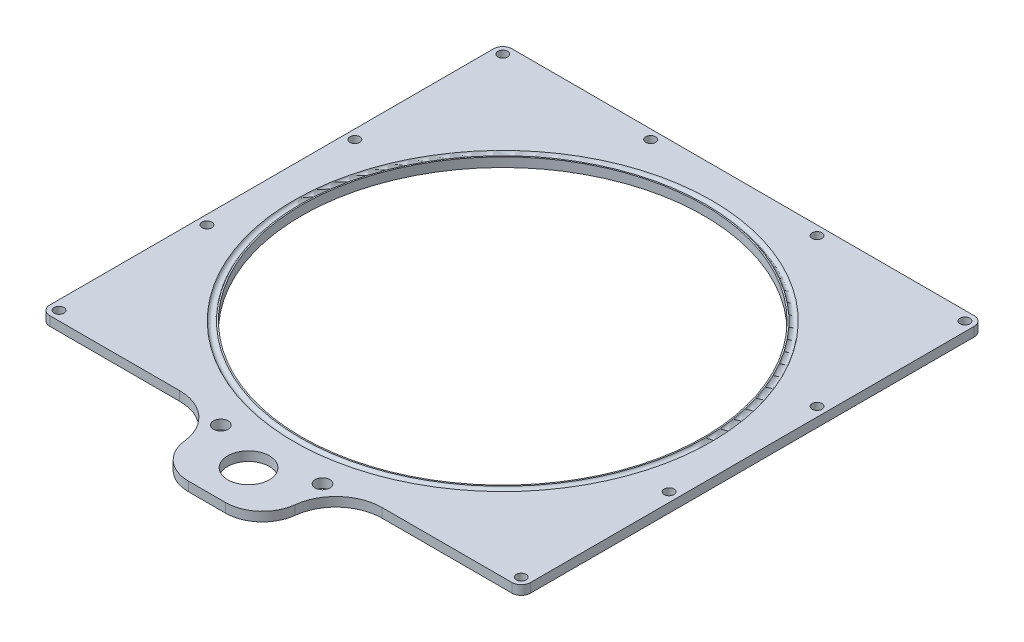
ISO-10303-21;
HEADER;
FILE_DESCRIPTION(('STEP AP214'),'2;1');
FILE_NAME('part.step','',(''),(''),'','','');
FILE_SCHEMA(('AUTOMOTIVE_DESIGN { 1 0 10303 214 1 1 1 1 }'));
ENDSEC;
DATA;
#1=APPLICATION_CONTEXT('core data for automotive mechanical design processes');
#2=APPLICATION_PROTOCOL_DEFINITION('international standard','automotive_design',2000,#1);
#3=PRODUCT_CONTEXT('',#1,'mechanical');
#4=PRODUCT('Part','Part','',(#3));
#5=PRODUCT_RELATED_PRODUCT_CATEGORY('part','',(#4));
#6=PRODUCT_DEFINITION_FORMATION('','',#4);
#7=PRODUCT_DEFINITION_CONTEXT('part definition',#1,'design');
#8=PRODUCT_DEFINITION('design','',#6,#7);
#9=PRODUCT_DEFINITION_SHAPE('','',#8);
#10=(LENGTH_UNIT() NAMED_UNIT(*) SI_UNIT(.MILLI.,.METRE.));
#11=(NAMED_UNIT(*) PLANE_ANGLE_UNIT() SI_UNIT($,.RADIAN.));
#12=(NAMED_UNIT(*) SI_UNIT($,.STERADIAN.) SOLID_ANGLE_UNIT());
#13=UNCERTAINTY_MEASURE_WITH_UNIT(LENGTH_MEASURE(1.E-05),#10,'distance_accuracy_value','');
#14=(GEOMETRIC_REPRESENTATION_CONTEXT(3) GLOBAL_UNCERTAINTY_ASSIGNED_CONTEXT((#13)) GLOBAL_UNIT_ASSIGNED_CONTEXT((#10,
#11,#12)) REPRESENTATION_CONTEXT('',''));
#15=CARTESIAN_POINT('',(0.,0.,0.));
#16=DIRECTION('',(0.,0.,1.));
#17=DIRECTION('',(1.,0.,0.));
#18=AXIS2_PLACEMENT_3D('',#15,#16,#17);
#19=CARTESIAN_POINT('',(0.,6.35,0.));
#20=DIRECTION('',(0.,-1.,0.));
#21=DIRECTION('',(0.,0.,-1.));
#22=AXIS2_PLACEMENT_3D('',#19,#20,#21);
#23=PLANE('',#22);
#24=CARTESIAN_POINT('',(0.,6.35,174.625));
#25=DIRECTION('',(0.,1.,0.));
#26=DIRECTION('',(0.,0.,1.));
#27=AXIS2_PLACEMENT_3D('',#24,#25,#26);
#28=CIRCLE('',#27,14.2875);
#29=CARTESIAN_POINT('',(0.,6.35,188.9125));
#30=VERTEX_POINT('',#29);
#31=EDGE_CURVE('E326',#30,#30,#28,.T.);
#32=ORIENTED_EDGE('',*,*,#31,.F.);
#33=EDGE_LOOP('',(#32));
#34=FACE_BOUND('',#33,.T.);
#35=DIRECTION('',(0.,0.,1.));
#36=VECTOR('',#35,1.);
#37=CARTESIAN_POINT('',(-165.1,6.35,152.4));
#38=LINE('',#37,#36);
#39=CARTESIAN_POINT('',(-165.1,6.35,-158.75));
#40=VERTEX_POINT('',#39);
#41=CARTESIAN_POINT('',(-165.1,6.35,146.05));
#42=VERTEX_POINT('',#41);
#43=EDGE_CURVE('E341',#40,#42,#38,.T.);
#44=ORIENTED_EDGE('',*,*,#43,.T.);
#45=CARTESIAN_POINT('',(-158.75,6.35,146.05));
#46=DIRECTION('',(0.,-1.,0.));
#47=DIRECTION('',(0.,0.,-1.));
#48=AXIS2_PLACEMENT_3D('',#45,#46,#47);
#49=CIRCLE('',#48,6.35);
#50=CARTESIAN_POINT('',(-158.75,6.35,152.4));
#51=VERTEX_POINT('',#50);
#52=EDGE_CURVE('E228',#42,#51,#49,.F.);
#53=ORIENTED_EDGE('',*,*,#52,.T.);
#54=DIRECTION('',(1.,0.,0.));
#55=VECTOR('',#54,1.);
#56=CARTESIAN_POINT('',(-165.1,6.35,152.4));
#57=LINE('',#56,#55);
#58=CARTESIAN_POINT('',(-69.4961266284947,6.35,152.4));
#59=VERTEX_POINT('',#58);
#60=EDGE_CURVE('E344',#51,#59,#57,.T.);
#61=ORIENTED_EDGE('',*,*,#60,.T.);
#62=CARTESIAN_POINT('',(-69.4961266284947,6.35,184.15));
#63=DIRECTION('',(0.,-1.,0.));
#64=DIRECTION('',(0.,0.,-1.));
#65=AXIS2_PLACEMENT_3D('',#62,#63,#64);
#66=CIRCLE('',#65,31.75);
#67=CARTESIAN_POINT('',(-37.9427229459976,6.35,180.622222222222));
#68=VERTEX_POINT('',#67);
#69=EDGE_CURVE('E205',#59,#68,#66,.T.);
#70=ORIENTED_EDGE('',*,*,#69,.T.);
#71=CARTESIAN_POINT('',(-12.7,6.35,177.8));
#72=DIRECTION('',(0.,-1.,0.));
#73=DIRECTION('',(0.,0.,-1.));
#74=AXIS2_PLACEMENT_3D('',#71,#72,#73);
#75=CIRCLE('',#74,25.4);
#76=CARTESIAN_POINT('',(-12.7,6.35,203.2));
#77=VERTEX_POINT('',#76);
#78=EDGE_CURVE('E185',#68,#77,#75,.F.);
#79=ORIENTED_EDGE('',*,*,#78,.T.);
#80=DIRECTION('',(1.,0.,0.));
#81=VECTOR('',#80,1.);
#82=CARTESIAN_POINT('',(38.1,6.35,203.2));
#83=LINE('',#82,#81);
#84=CARTESIAN_POINT('',(12.7,6.35,203.2));
#85=VERTEX_POINT('',#84);
#86=EDGE_CURVE('E166',#77,#85,#83,.T.);
#87=ORIENTED_EDGE('',*,*,#86,.T.);
#88=CARTESIAN_POINT('',(12.7,6.35,177.8));
#89=DIRECTION('',(0.,-1.,0.));
#90=DIRECTION('',(0.,0.,-1.));
#91=AXIS2_PLACEMENT_3D('',#88,#89,#90);
#92=CIRCLE('',#91,25.4);
#93=CARTESIAN_POINT('',(37.9427229459976,6.35,180.622222222222));
#94=VERTEX_POINT('',#93);
#95=EDGE_CURVE('E187',#85,#94,#92,.F.);
#96=ORIENTED_EDGE('',*,*,#95,.T.);
#97=CARTESIAN_POINT('',(69.4961266284947,6.35,184.15));
#98=DIRECTION('',(0.,-1.,0.));
#99=DIRECTION('',(0.,0.,-1.));
#100=AXIS2_PLACEMENT_3D('',#97,#98,#99);
#101=CIRCLE('',#100,31.75);
#102=CARTESIAN_POINT('',(69.4961266284947,6.35,152.4));
#103=VERTEX_POINT('',#102);
#104=EDGE_CURVE('E201',#94,#103,#101,.T.);
#105=ORIENTED_EDGE('',*,*,#104,.T.);
#106=DIRECTION('',(1.,0.,0.));
#107=VECTOR('',#106,1.);
#108=CARTESIAN_POINT('',(38.1,6.35,152.4));
#109=LINE('',#108,#107);
#110=CARTESIAN_POINT('',(158.75,6.35,152.4));
#111=VERTEX_POINT('',#110);
#112=EDGE_CURVE('E157',#103,#111,#109,.T.);
#113=ORIENTED_EDGE('',*,*,#112,.T.);
#114=CARTESIAN_POINT('',(158.75,6.35,146.05));
#115=DIRECTION('',(0.,-1.,0.));
#116=DIRECTION('',(0.,0.,-1.));
#117=AXIS2_PLACEMENT_3D('',#114,#115,#116);
#118=CIRCLE('',#117,6.35);
#119=CARTESIAN_POINT('',(165.1,6.35,146.05));
#120=VERTEX_POINT('',#119);
#121=EDGE_CURVE('E226',#111,#120,#118,.F.);
#122=ORIENTED_EDGE('',*,*,#121,.T.);
#123=DIRECTION('',(0.,0.,-1.));
#124=VECTOR('',#123,1.);
#125=CARTESIAN_POINT('',(165.1,6.35,152.4));
#126=LINE('',#125,#124);
#127=CARTESIAN_POINT('',(165.1,6.35,-158.75));
#128=VERTEX_POINT('',#127);
#129=EDGE_CURVE('E177',#120,#128,#126,.T.);
#130=ORIENTED_EDGE('',*,*,#129,.T.);
#131=CARTESIAN_POINT('',(158.75,6.35,-158.75));
#132=DIRECTION('',(0.,-1.,0.));
#133=DIRECTION('',(0.,0.,-1.));
#134=AXIS2_PLACEMENT_3D('',#131,#132,#133);
#135=CIRCLE('',#134,6.35);
#136=CARTESIAN_POINT('',(158.75,6.35,-165.1));
#137=VERTEX_POINT('',#136);
#138=EDGE_CURVE('E64',#128,#137,#135,.F.);
#139=ORIENTED_EDGE('',*,*,#138,.T.);
#140=DIRECTION('',(-1.,0.,0.));
#141=VECTOR('',#140,1.);
#142=CARTESIAN_POINT('',(-165.1,6.35,-165.1));
#143=LINE('',#142,#141);
#144=CARTESIAN_POINT('',(-158.75,6.35,-165.1));
#145=VERTEX_POINT('',#144);
#146=EDGE_CURVE('E339',#137,#145,#143,.T.);
#147=ORIENTED_EDGE('',*,*,#146,.T.);
#148=CARTESIAN_POINT('',(-158.75,6.35,-158.75));
#149=DIRECTION('',(0.,-1.,0.));
#150=DIRECTION('',(0.,0.,-1.));
#151=AXIS2_PLACEMENT_3D('',#148,#149,#150);
#152=CIRCLE('',#151,6.35);
#153=EDGE_CURVE('E223',#145,#40,#152,.F.);
#154=ORIENTED_EDGE('',*,*,#153,.T.);
#155=EDGE_LOOP('',(#44,#53,#61,#70,#79,#87,#96,#105,#113,#122,#130,#139,#147,#154));
#156=FACE_BOUND('',#155,.T.);
#157=CARTESIAN_POINT('',(34.925,6.35,158.75));
#158=DIRECTION('',(0.,-1.,0.));
#159=DIRECTION('',(0.,0.,-1.));
#160=AXIS2_PLACEMENT_3D('',#157,#158,#159);
#161=CIRCLE('',#160,5.04189999999999);
#162=CARTESIAN_POINT('',(34.925,6.35,153.7081));
#163=VERTEX_POINT('',#162);
#164=EDGE_CURVE('E322',#163,#163,#161,.T.);
#165=ORIENTED_EDGE('',*,*,#164,.T.);
#166=EDGE_LOOP('',(#165));
#167=FACE_BOUND('',#166,.T.);
#168=CARTESIAN_POINT('',(-34.925,6.35,158.75));
#169=DIRECTION('',(0.,-1.,0.));
#170=DIRECTION('',(0.,0.,-1.));
#171=AXIS2_PLACEMENT_3D('',#168,#169,#170);
#172=CIRCLE('',#171,5.0419);
#173=CARTESIAN_POINT('',(-34.925,6.35,153.7081));
#174=VERTEX_POINT('',#173);
#175=EDGE_CURVE('E316',#174,#174,#172,.T.);
#176=ORIENTED_EDGE('',*,*,#175,.T.);
#177=EDGE_LOOP('',(#176));
#178=FACE_BOUND('',#177,.T.);
#179=CARTESIAN_POINT('',(57.15,6.35,-158.75));
#180=DIRECTION('',(0.,1.,0.));
#181=DIRECTION('',(0.,0.,1.));
#182=AXIS2_PLACEMENT_3D('',#179,#180,#181);
#183=CIRCLE('',#182,3.3782);
#184=CARTESIAN_POINT('',(57.15,6.35,-155.3718));
#185=VERTEX_POINT('',#184);
#186=EDGE_CURVE('E307',#185,#185,#183,.T.);
#187=ORIENTED_EDGE('',*,*,#186,.F.);
#188=EDGE_LOOP('',(#187));
#189=FACE_BOUND('',#188,.T.);
#190=CARTESIAN_POINT('',(-57.15,6.35,-158.75));
#191=DIRECTION('',(0.,1.,0.));
#192=DIRECTION('',(0.,0.,1.));
#193=AXIS2_PLACEMENT_3D('',#190,#191,#192);
#194=CIRCLE('',#193,3.3782);
#195=CARTESIAN_POINT('',(-57.15,6.35,-155.3718));
#196=VERTEX_POINT('',#195);
#197=EDGE_CURVE('E301',#196,#196,#194,.T.);
#198=ORIENTED_EDGE('',*,*,#197,.F.);
#199=EDGE_LOOP('',(#198));
#200=FACE_BOUND('',#199,.T.);
#201=CARTESIAN_POINT('',(-158.749999999997,6.35,146.05));
#202=DIRECTION('',(0.,1.,0.));
#203=DIRECTION('',(0.,0.,1.));
#204=AXIS2_PLACEMENT_3D('',#201,#202,#203);
#205=CIRCLE('',#204,3.3782);
#206=CARTESIAN_POINT('',(-158.749999999997,6.35,149.4282));
#207=VERTEX_POINT('',#206);
#208=EDGE_CURVE('E295',#207,#207,#205,.T.);
#209=ORIENTED_EDGE('',*,*,#208,.F.);
#210=EDGE_LOOP('',(#209));
#211=FACE_BOUND('',#210,.T.);
#212=CARTESIAN_POINT('',(158.750000000003,6.35,146.05));
#213=DIRECTION('',(0.,1.,0.));
#214=DIRECTION('',(0.,0.,1.));
#215=AXIS2_PLACEMENT_3D('',#212,#213,#214);
#216=CIRCLE('',#215,3.3782);
#217=CARTESIAN_POINT('',(158.750000000003,6.35,149.4282));
#218=VERTEX_POINT('',#217);
#219=EDGE_CURVE('E289',#218,#218,#216,.T.);
#220=ORIENTED_EDGE('',*,*,#219,.F.);
#221=EDGE_LOOP('',(#220));
#222=FACE_BOUND('',#221,.T.);
#223=CARTESIAN_POINT('',(-158.749999999998,6.35,44.45));
#224=DIRECTION('',(0.,1.,0.));
#225=DIRECTION('',(0.,0.,1.));
#226=AXIS2_PLACEMENT_3D('',#223,#224,#225);
#227=CIRCLE('',#226,3.3782);
#228=CARTESIAN_POINT('',(-158.749999999998,6.35,47.8282));
#229=VERTEX_POINT('',#228);
#230=EDGE_CURVE('E283',#229,#229,#227,.T.);
#231=ORIENTED_EDGE('',*,*,#230,.F.);
#232=EDGE_LOOP('',(#231));
#233=FACE_BOUND('',#232,.T.);
#234=CARTESIAN_POINT('',(158.750000000002,6.35,44.45));
#235=DIRECTION('',(0.,1.,0.));
#236=DIRECTION('',(0.,0.,1.));
#237=AXIS2_PLACEMENT_3D('',#234,#235,#236);
#238=CIRCLE('',#237,3.3782);
#239=CARTESIAN_POINT('',(158.750000000002,6.35,47.8282));
#240=VERTEX_POINT('',#239);
#241=EDGE_CURVE('E277',#240,#240,#238,.T.);
#242=ORIENTED_EDGE('',*,*,#241,.F.);
#243=EDGE_LOOP('',(#242));
#244=FACE_BOUND('',#243,.T.);
#245=CARTESIAN_POINT('',(-158.749999999999,6.35,-57.1499999999999));
#246=DIRECTION('',(0.,1.,0.));
#247=DIRECTION('',(0.,0.,1.));
#248=AXIS2_PLACEMENT_3D('',#245,#246,#247);
#249=CIRCLE('',#248,3.3782);
#250=CARTESIAN_POINT('',(-158.749999999999,6.35,-53.7718));
#251=VERTEX_POINT('',#250);
#252=EDGE_CURVE('E271',#251,#251,#249,.T.);
#253=ORIENTED_EDGE('',*,*,#252,.F.);
#254=EDGE_LOOP('',(#253));
#255=FACE_BOUND('',#254,.T.);
#256=CARTESIAN_POINT('',(158.750000000001,6.35,-57.1499999999999));
#257=DIRECTION('',(0.,1.,0.));
#258=DIRECTION('',(0.,0.,1.));
#259=AXIS2_PLACEMENT_3D('',#256,#257,#258);
#260=CIRCLE('',#259,3.3782);
#261=CARTESIAN_POINT('',(158.750000000001,6.35,-53.7718));
#262=VERTEX_POINT('',#261);
#263=EDGE_CURVE('E265',#262,#262,#260,.T.);
#264=ORIENTED_EDGE('',*,*,#263,.F.);
#265=EDGE_LOOP('',(#264));
#266=FACE_BOUND('',#265,.T.);
#267=CARTESIAN_POINT('',(-158.75,6.35,-158.75));
#268=DIRECTION('',(0.,1.,0.));
#269=DIRECTION('',(0.,0.,1.));
#270=AXIS2_PLACEMENT_3D('',#267,#268,#269);
#271=CIRCLE('',#270,3.3782);
#272=CARTESIAN_POINT('',(-158.75,6.35,-155.3718));
#273=VERTEX_POINT('',#272);
#274=EDGE_CURVE('E257',#273,#273,#271,.T.);
#275=ORIENTED_EDGE('',*,*,#274,.F.);
#276=EDGE_LOOP('',(#275));
#277=FACE_BOUND('',#276,.T.);
#278=CARTESIAN_POINT('',(158.75,6.35,-158.75));
#279=DIRECTION('',(0.,1.,0.));
#280=DIRECTION('',(0.,0.,1.));
#281=AXIS2_PLACEMENT_3D('',#278,#279,#280);
#282=CIRCLE('',#281,3.3782);
#283=CARTESIAN_POINT('',(158.75,6.35,-155.3718));
#284=VERTEX_POINT('',#283);
#285=EDGE_CURVE('E248',#284,#284,#282,.T.);
#286=ORIENTED_EDGE('',*,*,#285,.F.);
#287=EDGE_LOOP('',(#286));
#288=FACE_BOUND('',#287,.T.);
#289=CARTESIAN_POINT('',(0.,6.35,0.));
#290=DIRECTION('',(0.,-1.,0.));
#291=DIRECTION('',(0.,0.,-1.));
#292=AXIS2_PLACEMENT_3D('',#289,#290,#291);
#293=CIRCLE('',#292,143.532564030267);
#294=CARTESIAN_POINT('',(0.,6.35,-143.532564030267));
#295=VERTEX_POINT('',#294);
#296=EDGE_CURVE('E45',#295,#295,#293,.F.);
#297=ORIENTED_EDGE('',*,*,#296,.F.);
#298=EDGE_LOOP('',(#297));
#299=FACE_BOUND('',#298,.T.);
#300=ADVANCED_FACE('F41',(#34,#156,#167,#178,#189,#200,#211,#222,#233,#244,#255,#266,#277,#288,
#299),#23,.F.);
#301=CARTESIAN_POINT('',(0.,0.,0.));
#302=DIRECTION('',(0.,-1.,0.));
#303=DIRECTION('',(0.,0.,-1.));
#304=AXIS2_PLACEMENT_3D('',#301,#302,#303);
#305=PLANE('',#304);
#306=CARTESIAN_POINT('',(0.,0.,174.625));
#307=DIRECTION('',(0.,1.,0.));
#308=DIRECTION('',(0.,0.,1.));
#309=AXIS2_PLACEMENT_3D('',#306,#307,#308);
#310=CIRCLE('',#309,14.2875);
#311=CARTESIAN_POINT('',(0.,0.,188.9125));
#312=VERTEX_POINT('',#311);
#313=EDGE_CURVE('E325',#312,#312,#310,.T.);
#314=ORIENTED_EDGE('',*,*,#313,.T.);
#315=EDGE_LOOP('',(#314));
#316=FACE_BOUND('',#315,.T.);
#317=DIRECTION('',(1.,0.,0.));
#318=VECTOR('',#317,1.);
#319=CARTESIAN_POINT('',(-165.1,0.,152.4));
#320=LINE('',#319,#318);
#321=CARTESIAN_POINT('',(-158.75,0.,152.4));
#322=VERTEX_POINT('',#321);
#323=CARTESIAN_POINT('',(-69.4961266284947,0.,152.4));
#324=VERTEX_POINT('',#323);
#325=EDGE_CURVE('E174',#322,#324,#320,.T.);
#326=ORIENTED_EDGE('',*,*,#325,.F.);
#327=CARTESIAN_POINT('',(-158.75,0.,146.05));
#328=DIRECTION('',(0.,-1.,0.));
#329=DIRECTION('',(0.,0.,-1.));
#330=AXIS2_PLACEMENT_3D('',#327,#328,#329);
#331=CIRCLE('',#330,6.35);
#332=CARTESIAN_POINT('',(-165.1,0.,146.05));
#333=VERTEX_POINT('',#332);
#334=EDGE_CURVE('E216',#322,#333,#331,.T.);
#335=ORIENTED_EDGE('',*,*,#334,.T.);
#336=DIRECTION('',(0.,0.,1.));
#337=VECTOR('',#336,1.);
#338=CARTESIAN_POINT('',(-165.1,0.,152.4));
#339=LINE('',#338,#337);
#340=CARTESIAN_POINT('',(-165.1,0.,-158.75));
#341=VERTEX_POINT('',#340);
#342=EDGE_CURVE('E179',#341,#333,#339,.T.);
#343=ORIENTED_EDGE('',*,*,#342,.F.);
#344=CARTESIAN_POINT('',(-158.75,0.,-158.75));
#345=DIRECTION('',(0.,-1.,0.));
#346=DIRECTION('',(0.,0.,-1.));
#347=AXIS2_PLACEMENT_3D('',#344,#345,#346);
#348=CIRCLE('',#347,6.35);
#349=CARTESIAN_POINT('',(-158.75,0.,-165.1));
#350=VERTEX_POINT('',#349);
#351=EDGE_CURVE('E210',#341,#350,#348,.T.);
#352=ORIENTED_EDGE('',*,*,#351,.T.);
#353=DIRECTION('',(-1.,0.,0.));
#354=VECTOR('',#353,1.);
#355=CARTESIAN_POINT('',(-165.1,0.,-165.1));
#356=LINE('',#355,#354);
#357=CARTESIAN_POINT('',(158.75,0.,-165.1));
#358=VERTEX_POINT('',#357);
#359=EDGE_CURVE('E351',#358,#350,#356,.T.);
#360=ORIENTED_EDGE('',*,*,#359,.F.);
#361=CARTESIAN_POINT('',(158.75,0.,-158.75));
#362=DIRECTION('',(0.,-1.,0.));
#363=DIRECTION('',(0.,0.,-1.));
#364=AXIS2_PLACEMENT_3D('',#361,#362,#363);
#365=CIRCLE('',#364,6.35);
#366=CARTESIAN_POINT('',(165.1,0.,-158.75));
#367=VERTEX_POINT('',#366);
#368=EDGE_CURVE('E212',#358,#367,#365,.T.);
#369=ORIENTED_EDGE('',*,*,#368,.T.);
#370=DIRECTION('',(0.,0.,-1.));
#371=VECTOR('',#370,1.);
#372=CARTESIAN_POINT('',(165.1,0.,152.4));
#373=LINE('',#372,#371);
#374=CARTESIAN_POINT('',(165.1,0.,146.05));
#375=VERTEX_POINT('',#374);
#376=EDGE_CURVE('E335',#375,#367,#373,.T.);
#377=ORIENTED_EDGE('',*,*,#376,.F.);
#378=CARTESIAN_POINT('',(158.75,0.,146.05));
#379=DIRECTION('',(0.,-1.,0.));
#380=DIRECTION('',(0.,0.,-1.));
#381=AXIS2_PLACEMENT_3D('',#378,#379,#380);
#382=CIRCLE('',#381,6.35);
#383=CARTESIAN_POINT('',(158.75,0.,152.4));
#384=VERTEX_POINT('',#383);
#385=EDGE_CURVE('E214',#375,#384,#382,.T.);
#386=ORIENTED_EDGE('',*,*,#385,.T.);
#387=DIRECTION('',(1.,0.,0.));
#388=VECTOR('',#387,1.);
#389=CARTESIAN_POINT('',(38.1,0.,152.4));
#390=LINE('',#389,#388);
#391=CARTESIAN_POINT('',(69.4961266284947,0.,152.4));
#392=VERTEX_POINT('',#391);
#393=EDGE_CURVE('E173',#392,#384,#390,.T.);
#394=ORIENTED_EDGE('',*,*,#393,.F.);
#395=CARTESIAN_POINT('',(69.4961266284947,0.,184.15));
#396=DIRECTION('',(0.,-1.,0.));
#397=DIRECTION('',(0.,0.,-1.));
#398=AXIS2_PLACEMENT_3D('',#395,#396,#397);
#399=CIRCLE('',#398,31.75);
#400=CARTESIAN_POINT('',(37.9427229459976,0.,180.622222222222));
#401=VERTEX_POINT('',#400);
#402=EDGE_CURVE('E199',#392,#401,#399,.F.);
#403=ORIENTED_EDGE('',*,*,#402,.T.);
#404=CARTESIAN_POINT('',(12.7,0.,177.8));
#405=DIRECTION('',(0.,-1.,0.));
#406=DIRECTION('',(0.,0.,-1.));
#407=AXIS2_PLACEMENT_3D('',#404,#405,#406);
#408=CIRCLE('',#407,25.4);
#409=CARTESIAN_POINT('',(12.7,0.,203.2));
#410=VERTEX_POINT('',#409);
#411=EDGE_CURVE('E156',#401,#410,#408,.T.);
#412=ORIENTED_EDGE('',*,*,#411,.T.);
#413=DIRECTION('',(1.,0.,0.));
#414=VECTOR('',#413,1.);
#415=CARTESIAN_POINT('',(38.1,0.,203.2));
#416=LINE('',#415,#414);
#417=CARTESIAN_POINT('',(-12.7,0.,203.2));
#418=VERTEX_POINT('',#417);
#419=EDGE_CURVE('E163',#418,#410,#416,.T.);
#420=ORIENTED_EDGE('',*,*,#419,.F.);
#421=CARTESIAN_POINT('',(-12.7,0.,177.8));
#422=DIRECTION('',(0.,-1.,0.));
#423=DIRECTION('',(0.,0.,-1.));
#424=AXIS2_PLACEMENT_3D('',#421,#422,#423);
#425=CIRCLE('',#424,25.4);
#426=CARTESIAN_POINT('',(-37.9427229459976,0.,180.622222222222));
#427=VERTEX_POINT('',#426);
#428=EDGE_CURVE('E146',#418,#427,#425,.T.);
#429=ORIENTED_EDGE('',*,*,#428,.T.);
#430=CARTESIAN_POINT('',(-69.4961266284947,0.,184.15));
#431=DIRECTION('',(0.,-1.,0.));
#432=DIRECTION('',(0.,0.,-1.));
#433=AXIS2_PLACEMENT_3D('',#430,#431,#432);
#434=CIRCLE('',#433,31.75);
#435=EDGE_CURVE('E203',#427,#324,#434,.F.);
#436=ORIENTED_EDGE('',*,*,#435,.T.);
#437=EDGE_LOOP('',(#326,#335,#343,#352,#360,#369,#377,#386,#394,#403,#412,#420,#429,#436));
#438=FACE_BOUND('',#437,.T.);
#439=CARTESIAN_POINT('',(34.925,0.,158.75));
#440=DIRECTION('',(0.,-1.,0.));
#441=DIRECTION('',(0.,0.,-1.));
#442=AXIS2_PLACEMENT_3D('',#439,#440,#441);
#443=CIRCLE('',#442,5.0419);
#444=CARTESIAN_POINT('',(34.925,0.,153.7081));
#445=VERTEX_POINT('',#444);
#446=EDGE_CURVE('E319',#445,#445,#443,.T.);
#447=ORIENTED_EDGE('',*,*,#446,.F.);
#448=EDGE_LOOP('',(#447));
#449=FACE_BOUND('',#448,.T.);
#450=CARTESIAN_POINT('',(-34.925,0.,158.75));
#451=DIRECTION('',(0.,-1.,0.));
#452=DIRECTION('',(0.,0.,-1.));
#453=AXIS2_PLACEMENT_3D('',#450,#451,#452);
#454=CIRCLE('',#453,5.0419);
#455=CARTESIAN_POINT('',(-34.925,0.,153.7081));
#456=VERTEX_POINT('',#455);
#457=EDGE_CURVE('E313',#456,#456,#454,.T.);
#458=ORIENTED_EDGE('',*,*,#457,.F.);
#459=EDGE_LOOP('',(#458));
#460=FACE_BOUND('',#459,.T.);
#461=CARTESIAN_POINT('',(57.15,0.,-158.75));
#462=DIRECTION('',(0.,1.,0.));
#463=DIRECTION('',(0.,0.,1.));
#464=AXIS2_PLACEMENT_3D('',#461,#462,#463);
#465=CIRCLE('',#464,3.3782);
#466=CARTESIAN_POINT('',(57.15,0.,-155.3718));
#467=VERTEX_POINT('',#466);
#468=EDGE_CURVE('E310',#467,#467,#465,.T.);
#469=ORIENTED_EDGE('',*,*,#468,.T.);
#470=EDGE_LOOP('',(#469));
#471=FACE_BOUND('',#470,.T.);
#472=CARTESIAN_POINT('',(-57.15,0.,-158.75));
#473=DIRECTION('',(0.,1.,0.));
#474=DIRECTION('',(0.,0.,1.));
#475=AXIS2_PLACEMENT_3D('',#472,#473,#474);
#476=CIRCLE('',#475,3.3782);
#477=CARTESIAN_POINT('',(-57.15,0.,-155.3718));
#478=VERTEX_POINT('',#477);
#479=EDGE_CURVE('E304',#478,#478,#476,.T.);
#480=ORIENTED_EDGE('',*,*,#479,.T.);
#481=EDGE_LOOP('',(#480));
#482=FACE_BOUND('',#481,.T.);
#483=CARTESIAN_POINT('',(-158.749999999997,0.,146.05));
#484=DIRECTION('',(0.,1.,0.));
#485=DIRECTION('',(0.,0.,1.));
#486=AXIS2_PLACEMENT_3D('',#483,#484,#485);
#487=CIRCLE('',#486,3.3782);
#488=CARTESIAN_POINT('',(-158.749999999997,0.,149.4282));
#489=VERTEX_POINT('',#488);
#490=EDGE_CURVE('E298',#489,#489,#487,.T.);
#491=ORIENTED_EDGE('',*,*,#490,.T.);
#492=EDGE_LOOP('',(#491));
#493=FACE_BOUND('',#492,.T.);
#494=CARTESIAN_POINT('',(158.750000000003,0.,146.05));
#495=DIRECTION('',(0.,1.,0.));
#496=DIRECTION('',(0.,0.,1.));
#497=AXIS2_PLACEMENT_3D('',#494,#495,#496);
#498=CIRCLE('',#497,3.3782);
#499=CARTESIAN_POINT('',(158.750000000003,0.,149.4282));
#500=VERTEX_POINT('',#499);
#501=EDGE_CURVE('E292',#500,#500,#498,.T.);
#502=ORIENTED_EDGE('',*,*,#501,.T.);
#503=EDGE_LOOP('',(#502));
#504=FACE_BOUND('',#503,.T.);
#505=CARTESIAN_POINT('',(-158.749999999998,0.,44.45));
#506=DIRECTION('',(0.,1.,0.));
#507=DIRECTION('',(0.,0.,1.));
#508=AXIS2_PLACEMENT_3D('',#505,#506,#507);
#509=CIRCLE('',#508,3.3782);
#510=CARTESIAN_POINT('',(-158.749999999998,0.,47.8282));
#511=VERTEX_POINT('',#510);
#512=EDGE_CURVE('E286',#511,#511,#509,.T.);
#513=ORIENTED_EDGE('',*,*,#512,.T.);
#514=EDGE_LOOP('',(#513));
#515=FACE_BOUND('',#514,.T.);
#516=CARTESIAN_POINT('',(158.750000000002,0.,44.45));
#517=DIRECTION('',(0.,1.,0.));
#518=DIRECTION('',(0.,0.,1.));
#519=AXIS2_PLACEMENT_3D('',#516,#517,#518);
#520=CIRCLE('',#519,3.3782);
#521=CARTESIAN_POINT('',(158.750000000002,0.,47.8282));
#522=VERTEX_POINT('',#521);
#523=EDGE_CURVE('E280',#522,#522,#520,.T.);
#524=ORIENTED_EDGE('',*,*,#523,.T.);
#525=EDGE_LOOP('',(#524));
#526=FACE_BOUND('',#525,.T.);
#527=CARTESIAN_POINT('',(-158.749999999999,0.,-57.1499999999999));
#528=DIRECTION('',(0.,1.,0.));
#529=DIRECTION('',(0.,0.,1.));
#530=AXIS2_PLACEMENT_3D('',#527,#528,#529);
#531=CIRCLE('',#530,3.3782);
#532=CARTESIAN_POINT('',(-158.749999999999,0.,-53.7718));
#533=VERTEX_POINT('',#532);
#534=EDGE_CURVE('E274',#533,#533,#531,.T.);
#535=ORIENTED_EDGE('',*,*,#534,.T.);
#536=EDGE_LOOP('',(#535));
#537=FACE_BOUND('',#536,.T.);
#538=CARTESIAN_POINT('',(158.750000000001,0.,-57.1499999999999));
#539=DIRECTION('',(0.,1.,0.));
#540=DIRECTION('',(0.,0.,1.));
#541=AXIS2_PLACEMENT_3D('',#538,#539,#540);
#542=CIRCLE('',#541,3.3782);
#543=CARTESIAN_POINT('',(158.750000000001,0.,-53.7718));
#544=VERTEX_POINT('',#543);
#545=EDGE_CURVE('E268',#544,#544,#542,.T.);
#546=ORIENTED_EDGE('',*,*,#545,.T.);
#547=EDGE_LOOP('',(#546));
#548=FACE_BOUND('',#547,.T.);
#549=CARTESIAN_POINT('',(-158.75,0.,-158.75));
#550=DIRECTION('',(0.,1.,0.));
#551=DIRECTION('',(0.,0.,1.));
#552=AXIS2_PLACEMENT_3D('',#549,#550,#551);
#553=CIRCLE('',#552,3.3782);
#554=CARTESIAN_POINT('',(-158.75,0.,-155.3718));
#555=VERTEX_POINT('',#554);
#556=EDGE_CURVE('E262',#555,#555,#553,.T.);
#557=ORIENTED_EDGE('',*,*,#556,.T.);
#558=EDGE_LOOP('',(#557));
#559=FACE_BOUND('',#558,.T.);
#560=CARTESIAN_POINT('',(158.75,0.,-158.75));
#561=DIRECTION('',(0.,1.,0.));
#562=DIRECTION('',(0.,0.,1.));
#563=AXIS2_PLACEMENT_3D('',#560,#561,#562);
#564=CIRCLE('',#563,3.3782);
#565=CARTESIAN_POINT('',(158.75,0.,-155.3718));
#566=VERTEX_POINT('',#565);
#567=EDGE_CURVE('E252',#566,#566,#564,.T.);
#568=ORIENTED_EDGE('',*,*,#567,.T.);
#569=EDGE_LOOP('',(#568));
#570=FACE_BOUND('',#569,.T.);
#571=CARTESIAN_POINT('',(0.,0.,0.));
#572=DIRECTION('',(0.,-1.,0.));
#573=DIRECTION('',(0.,0.,-1.));
#574=AXIS2_PLACEMENT_3D('',#571,#572,#573);
#575=CIRCLE('',#574,143.532564030267);
#576=CARTESIAN_POINT('',(0.,0.,-143.532564030267));
#577=VERTEX_POINT('',#576);
#578=EDGE_CURVE('E241',#577,#577,#575,.F.);
#579=ORIENTED_EDGE('',*,*,#578,.T.);
#580=EDGE_LOOP('',(#579));
#581=FACE_BOUND('',#580,.T.);
#582=ADVANCED_FACE('F170',(#316,#438,#449,#460,#471,#482,#493,#504,#515,#526,#537,#548,#559,
#570,#581),#305,.T.);
#583=CARTESIAN_POINT('',(165.1,6.35,152.4));
#584=DIRECTION('',(-1.,0.,0.));
#585=DIRECTION('',(0.,0.,1.));
#586=AXIS2_PLACEMENT_3D('',#583,#584,#585);
#587=PLANE('',#586);
#588=ORIENTED_EDGE('',*,*,#129,.F.);
#589=DIRECTION('',(0.,-1.,0.));
#590=VECTOR('',#589,1.);
#591=CARTESIAN_POINT('',(165.1,6.35,146.05));
#592=LINE('',#591,#590);
#593=EDGE_CURVE('E232',#120,#375,#592,.T.);
#594=ORIENTED_EDGE('',*,*,#593,.T.);
#595=ORIENTED_EDGE('',*,*,#376,.T.);
#596=DIRECTION('',(0.,-1.,0.));
#597=VECTOR('',#596,1.);
#598=CARTESIAN_POINT('',(165.1,6.35,-158.75));
#599=LINE('',#598,#597);
#600=EDGE_CURVE('E230',#367,#128,#599,.F.);
#601=ORIENTED_EDGE('',*,*,#600,.T.);
#602=EDGE_LOOP('',(#588,#594,#595,#601));
#603=FACE_BOUND('',#602,.T.);
#604=ADVANCED_FACE('F390',(#603),#587,.F.);
#605=CARTESIAN_POINT('',(-165.1,6.35,-165.1));
#606=DIRECTION('',(0.,0.,1.));
#607=DIRECTION('',(1.,0.,0.));
#608=AXIS2_PLACEMENT_3D('',#605,#606,#607);
#609=PLANE('',#608);
#610=ORIENTED_EDGE('',*,*,#146,.F.);
#611=DIRECTION('',(0.,-1.,0.));
#612=VECTOR('',#611,1.);
#613=CARTESIAN_POINT('',(158.75,6.35,-165.1));
#614=LINE('',#613,#612);
#615=EDGE_CURVE('E12',#137,#358,#614,.T.);
#616=ORIENTED_EDGE('',*,*,#615,.T.);
#617=ORIENTED_EDGE('',*,*,#359,.T.);
#618=DIRECTION('',(0.,-1.,0.));
#619=VECTOR('',#618,1.);
#620=CARTESIAN_POINT('',(-158.75,6.35,-165.1));
#621=LINE('',#620,#619);
#622=EDGE_CURVE('E50',#350,#145,#621,.F.);
#623=ORIENTED_EDGE('',*,*,#622,.T.);
#624=EDGE_LOOP('',(#610,#616,#617,#623));
#625=FACE_BOUND('',#624,.T.);
#626=ADVANCED_FACE('F397',(#625),#609,.F.);
#627=CARTESIAN_POINT('',(-165.1,6.35,152.4));
#628=DIRECTION('',(1.,0.,0.));
#629=DIRECTION('',(0.,0.,-1.));
#630=AXIS2_PLACEMENT_3D('',#627,#628,#629);
#631=PLANE('',#630);
#632=ORIENTED_EDGE('',*,*,#342,.T.);
#633=DIRECTION('',(0.,-1.,0.));
#634=VECTOR('',#633,1.);
#635=CARTESIAN_POINT('',(-165.1,6.35,146.05));
#636=LINE('',#635,#634);
#637=EDGE_CURVE('E221',#333,#42,#636,.F.);
#638=ORIENTED_EDGE('',*,*,#637,.T.);
#639=ORIENTED_EDGE('',*,*,#43,.F.);
#640=DIRECTION('',(0.,-1.,0.));
#641=VECTOR('',#640,1.);
#642=CARTESIAN_POINT('',(-165.1,6.35,-158.75));
#643=LINE('',#642,#641);
#644=EDGE_CURVE('E218',#40,#341,#643,.T.);
#645=ORIENTED_EDGE('',*,*,#644,.T.);
#646=EDGE_LOOP('',(#632,#638,#639,#645));
#647=FACE_BOUND('',#646,.T.);
#648=ADVANCED_FACE('F356',(#647),#631,.F.);
#649=CARTESIAN_POINT('',(-165.1,6.35,152.4));
#650=DIRECTION('',(0.,0.,-1.));
#651=DIRECTION('',(-1.,0.,0.));
#652=AXIS2_PLACEMENT_3D('',#649,#650,#651);
#653=PLANE('',#652);
#654=ORIENTED_EDGE('',*,*,#60,.F.);
#655=DIRECTION('',(0.,-1.,0.));
#656=VECTOR('',#655,1.);
#657=CARTESIAN_POINT('',(-158.75,6.35,152.4));
#658=LINE('',#657,#656);
#659=EDGE_CURVE('E207',#51,#322,#658,.T.);
#660=ORIENTED_EDGE('',*,*,#659,.T.);
#661=ORIENTED_EDGE('',*,*,#325,.T.);
#662=DIRECTION('',(0.,-1.,0.));
#663=VECTOR('',#662,1.);
#664=CARTESIAN_POINT('',(-69.4961266284947,6.35,152.4));
#665=LINE('',#664,#663);
#666=EDGE_CURVE('E196',#324,#59,#665,.F.);
#667=ORIENTED_EDGE('',*,*,#666,.T.);
#668=EDGE_LOOP('',(#654,#660,#661,#667));
#669=FACE_BOUND('',#668,.T.);
#670=ADVANCED_FACE('F366',(#669),#653,.F.);
#671=CARTESIAN_POINT('',(38.1,6.35,203.2));
#672=DIRECTION('',(0.,0.,-1.));
#673=DIRECTION('',(-1.,0.,0.));
#674=AXIS2_PLACEMENT_3D('',#671,#672,#673);
#675=PLANE('',#674);
#676=ORIENTED_EDGE('',*,*,#419,.T.);
#677=DIRECTION('',(0.,-1.,0.));
#678=VECTOR('',#677,1.);
#679=CARTESIAN_POINT('',(12.7,6.35,203.2));
#680=LINE('',#679,#678);
#681=EDGE_CURVE('E167',#410,#85,#680,.F.);
#682=ORIENTED_EDGE('',*,*,#681,.T.);
#683=ORIENTED_EDGE('',*,*,#86,.F.);
#684=DIRECTION('',(0.,-1.,0.));
#685=VECTOR('',#684,1.);
#686=CARTESIAN_POINT('',(-12.7,6.35,203.2));
#687=LINE('',#686,#685);
#688=EDGE_CURVE('E150',#77,#418,#687,.T.);
#689=ORIENTED_EDGE('',*,*,#688,.T.);
#690=EDGE_LOOP('',(#676,#682,#683,#689));
#691=FACE_BOUND('',#690,.T.);
#692=ADVANCED_FACE('F162',(#691),#675,.F.);
#693=CARTESIAN_POINT('',(38.1,6.35,152.4));
#694=DIRECTION('',(0.,0.,-1.));
#695=DIRECTION('',(-1.,0.,0.));
#696=AXIS2_PLACEMENT_3D('',#693,#694,#695);
#697=PLANE('',#696);
#698=ORIENTED_EDGE('',*,*,#393,.T.);
#699=DIRECTION('',(0.,-1.,0.));
#700=VECTOR('',#699,1.);
#701=CARTESIAN_POINT('',(158.75,6.35,152.4));
#702=LINE('',#701,#700);
#703=EDGE_CURVE('E235',#384,#111,#702,.F.);
#704=ORIENTED_EDGE('',*,*,#703,.T.);
#705=ORIENTED_EDGE('',*,*,#112,.F.);
#706=DIRECTION('',(0.,-1.,0.));
#707=VECTOR('',#706,1.);
#708=CARTESIAN_POINT('',(69.4961266284947,6.35,152.4));
#709=LINE('',#708,#707);
#710=EDGE_CURVE('E190',#103,#392,#709,.T.);
#711=ORIENTED_EDGE('',*,*,#710,.T.);
#712=EDGE_LOOP('',(#698,#704,#705,#711));
#713=FACE_BOUND('',#712,.T.);
#714=ADVANCED_FACE('F382',(#713),#697,.F.);
#715=CARTESIAN_POINT('',(0.,6.35,174.625));
#716=DIRECTION('',(0.,-1.,0.));
#717=DIRECTION('',(0.,0.,-1.));
#718=AXIS2_PLACEMENT_3D('',#715,#716,#717);
#719=CYLINDRICAL_SURFACE('',#718,14.2875);
#720=ORIENTED_EDGE('',*,*,#31,.T.);
#721=EDGE_LOOP('',(#720));
#722=FACE_BOUND('',#721,.T.);
#723=ORIENTED_EDGE('',*,*,#313,.F.);
#724=EDGE_LOOP('',(#723));
#725=FACE_BOUND('',#724,.T.);
#726=ADVANCED_FACE('F444',(#722,#725),#719,.F.);
#727=CARTESIAN_POINT('',(12.7,6.35,177.8));
#728=DIRECTION('',(0.,-1.,0.));
#729=DIRECTION('',(0.,0.,-1.));
#730=AXIS2_PLACEMENT_3D('',#727,#728,#729);
#731=CYLINDRICAL_SURFACE('',#730,25.4);
#732=ORIENTED_EDGE('',*,*,#411,.F.);
#733=DIRECTION('',(0.,-1.,0.));
#734=VECTOR('',#733,1.);
#735=CARTESIAN_POINT('',(37.9427229459976,6.35,180.622222222222));
#736=LINE('',#735,#734);
#737=EDGE_CURVE('E193',#401,#94,#736,.F.);
#738=ORIENTED_EDGE('',*,*,#737,.T.);
#739=ORIENTED_EDGE('',*,*,#95,.F.);
#740=ORIENTED_EDGE('',*,*,#681,.F.);
#741=EDGE_LOOP('',(#732,#738,#739,#740));
#742=FACE_BOUND('',#741,.T.);
#743=ADVANCED_FACE('F374',(#742),#731,.T.);
#744=CARTESIAN_POINT('',(-12.7,6.35,177.8));
#745=DIRECTION('',(0.,-1.,0.));
#746=DIRECTION('',(0.,0.,-1.));
#747=AXIS2_PLACEMENT_3D('',#744,#745,#746);
#748=CYLINDRICAL_SURFACE('',#747,25.4);
#749=ORIENTED_EDGE('',*,*,#78,.F.);
#750=DIRECTION('',(0.,-1.,0.));
#751=VECTOR('',#750,1.);
#752=CARTESIAN_POINT('',(-37.9427229459976,6.35,180.622222222222));
#753=LINE('',#752,#751);
#754=EDGE_CURVE('E152',#68,#427,#753,.T.);
#755=ORIENTED_EDGE('',*,*,#754,.T.);
#756=ORIENTED_EDGE('',*,*,#428,.F.);
#757=ORIENTED_EDGE('',*,*,#688,.F.);
#758=EDGE_LOOP('',(#749,#755,#756,#757));
#759=FACE_BOUND('',#758,.T.);
#760=ADVANCED_FACE('F149',(#759),#748,.T.);
#761=CARTESIAN_POINT('',(69.4961266284947,6.35,184.15));
#762=DIRECTION('',(0.,-1.,0.));
#763=DIRECTION('',(0.,0.,-1.));
#764=AXIS2_PLACEMENT_3D('',#761,#762,#763);
#765=CYLINDRICAL_SURFACE('',#764,31.75);
#766=ORIENTED_EDGE('',*,*,#104,.F.);
#767=ORIENTED_EDGE('',*,*,#737,.F.);
#768=ORIENTED_EDGE('',*,*,#402,.F.);
#769=ORIENTED_EDGE('',*,*,#710,.F.);
#770=EDGE_LOOP('',(#766,#767,#768,#769));
#771=FACE_BOUND('',#770,.T.);
#772=ADVANCED_FACE('F377',(#771),#765,.F.);
#773=CARTESIAN_POINT('',(-69.4961266284947,6.35,184.15));
#774=DIRECTION('',(0.,-1.,0.));
#775=DIRECTION('',(0.,0.,-1.));
#776=AXIS2_PLACEMENT_3D('',#773,#774,#775);
#777=CYLINDRICAL_SURFACE('',#776,31.75);
#778=ORIENTED_EDGE('',*,*,#69,.F.);
#779=ORIENTED_EDGE('',*,*,#666,.F.);
#780=ORIENTED_EDGE('',*,*,#435,.F.);
#781=ORIENTED_EDGE('',*,*,#754,.F.);
#782=EDGE_LOOP('',(#778,#779,#780,#781));
#783=FACE_BOUND('',#782,.T.);
#784=ADVANCED_FACE('F370',(#783),#777,.F.);
#785=CARTESIAN_POINT('',(34.925,0.,158.75));
#786=DIRECTION('',(0.,-1.,0.));
#787=DIRECTION('',(0.,0.,-1.));
#788=AXIS2_PLACEMENT_3D('',#785,#786,#787);
#789=CYLINDRICAL_SURFACE('',#788,5.0419);
#790=ORIENTED_EDGE('',*,*,#164,.F.);
#791=EDGE_LOOP('',(#790));
#792=FACE_BOUND('',#791,.T.);
#793=ORIENTED_EDGE('',*,*,#446,.T.);
#794=EDGE_LOOP('',(#793));
#795=FACE_BOUND('',#794,.T.);
#796=ADVANCED_FACE('F463',(#792,#795),#789,.F.);
#797=CARTESIAN_POINT('',(-34.925,0.,158.75));
#798=DIRECTION('',(0.,-1.,0.));
#799=DIRECTION('',(0.,0.,-1.));
#800=AXIS2_PLACEMENT_3D('',#797,#798,#799);
#801=CYLINDRICAL_SURFACE('',#800,5.0419);
#802=ORIENTED_EDGE('',*,*,#175,.F.);
#803=EDGE_LOOP('',(#802));
#804=FACE_BOUND('',#803,.T.);
#805=ORIENTED_EDGE('',*,*,#457,.T.);
#806=EDGE_LOOP('',(#805));
#807=FACE_BOUND('',#806,.T.);
#808=ADVANCED_FACE('F606',(#804,#807),#801,.F.);
#809=CARTESIAN_POINT('',(57.15,6.35,-158.75));
#810=DIRECTION('',(0.,1.,0.));
#811=DIRECTION('',(0.,0.,1.));
#812=AXIS2_PLACEMENT_3D('',#809,#810,#811);
#813=CYLINDRICAL_SURFACE('',#812,3.3782);
#814=ORIENTED_EDGE('',*,*,#468,.F.);
#815=EDGE_LOOP('',(#814));
#816=FACE_BOUND('',#815,.T.);
#817=ORIENTED_EDGE('',*,*,#186,.T.);
#818=EDGE_LOOP('',(#817));
#819=FACE_BOUND('',#818,.T.);
#820=ADVANCED_FACE('F597',(#816,#819),#813,.F.);
#821=CARTESIAN_POINT('',(-57.15,6.35,-158.75));
#822=DIRECTION('',(0.,1.,0.));
#823=DIRECTION('',(0.,0.,1.));
#824=AXIS2_PLACEMENT_3D('',#821,#822,#823);
#825=CYLINDRICAL_SURFACE('',#824,3.3782);
#826=ORIENTED_EDGE('',*,*,#479,.F.);
#827=EDGE_LOOP('',(#826));
#828=FACE_BOUND('',#827,.T.);
#829=ORIENTED_EDGE('',*,*,#197,.T.);
#830=EDGE_LOOP('',(#829));
#831=FACE_BOUND('',#830,.T.);
#832=ADVANCED_FACE('F588',(#828,#831),#825,.F.);
#833=CARTESIAN_POINT('',(-158.749999999997,6.35,146.05));
#834=DIRECTION('',(0.,1.,0.));
#835=DIRECTION('',(0.,0.,1.));
#836=AXIS2_PLACEMENT_3D('',#833,#834,#835);
#837=CYLINDRICAL_SURFACE('',#836,3.3782);
#838=ORIENTED_EDGE('',*,*,#490,.F.);
#839=EDGE_LOOP('',(#838));
#840=FACE_BOUND('',#839,.T.);
#841=ORIENTED_EDGE('',*,*,#208,.T.);
#842=EDGE_LOOP('',(#841));
#843=FACE_BOUND('',#842,.T.);
#844=ADVANCED_FACE('F579',(#840,#843),#837,.F.);
#845=CARTESIAN_POINT('',(158.750000000003,6.35,146.05));
#846=DIRECTION('',(0.,1.,0.));
#847=DIRECTION('',(0.,0.,1.));
#848=AXIS2_PLACEMENT_3D('',#845,#846,#847);
#849=CYLINDRICAL_SURFACE('',#848,3.3782);
#850=ORIENTED_EDGE('',*,*,#501,.F.);
#851=EDGE_LOOP('',(#850));
#852=FACE_BOUND('',#851,.T.);
#853=ORIENTED_EDGE('',*,*,#219,.T.);
#854=EDGE_LOOP('',(#853));
#855=FACE_BOUND('',#854,.T.);
#856=ADVANCED_FACE('F570',(#852,#855),#849,.F.);
#857=CARTESIAN_POINT('',(-158.749999999998,6.35,44.45));
#858=DIRECTION('',(0.,1.,0.));
#859=DIRECTION('',(0.,0.,1.));
#860=AXIS2_PLACEMENT_3D('',#857,#858,#859);
#861=CYLINDRICAL_SURFACE('',#860,3.3782);
#862=ORIENTED_EDGE('',*,*,#512,.F.);
#863=EDGE_LOOP('',(#862));
#864=FACE_BOUND('',#863,.T.);
#865=ORIENTED_EDGE('',*,*,#230,.T.);
#866=EDGE_LOOP('',(#865));
#867=FACE_BOUND('',#866,.T.);
#868=ADVANCED_FACE('F561',(#864,#867),#861,.F.);
#869=CARTESIAN_POINT('',(158.750000000002,6.35,44.45));
#870=DIRECTION('',(0.,1.,0.));
#871=DIRECTION('',(0.,0.,1.));
#872=AXIS2_PLACEMENT_3D('',#869,#870,#871);
#873=CYLINDRICAL_SURFACE('',#872,3.3782);
#874=ORIENTED_EDGE('',*,*,#523,.F.);
#875=EDGE_LOOP('',(#874));
#876=FACE_BOUND('',#875,.T.);
#877=ORIENTED_EDGE('',*,*,#241,.T.);
#878=EDGE_LOOP('',(#877));
#879=FACE_BOUND('',#878,.T.);
#880=ADVANCED_FACE('F552',(#876,#879),#873,.F.);
#881=CARTESIAN_POINT('',(-158.749999999999,6.35,-57.1499999999999));
#882=DIRECTION('',(0.,1.,0.));
#883=DIRECTION('',(0.,0.,1.));
#884=AXIS2_PLACEMENT_3D('',#881,#882,#883);
#885=CYLINDRICAL_SURFACE('',#884,3.3782);
#886=ORIENTED_EDGE('',*,*,#534,.F.);
#887=EDGE_LOOP('',(#886));
#888=FACE_BOUND('',#887,.T.);
#889=ORIENTED_EDGE('',*,*,#252,.T.);
#890=EDGE_LOOP('',(#889));
#891=FACE_BOUND('',#890,.T.);
#892=ADVANCED_FACE('F543',(#888,#891),#885,.F.);
#893=CARTESIAN_POINT('',(158.750000000001,6.35,-57.1499999999999));
#894=DIRECTION('',(0.,1.,0.));
#895=DIRECTION('',(0.,0.,1.));
#896=AXIS2_PLACEMENT_3D('',#893,#894,#895);
#897=CYLINDRICAL_SURFACE('',#896,3.3782);
#898=ORIENTED_EDGE('',*,*,#545,.F.);
#899=EDGE_LOOP('',(#898));
#900=FACE_BOUND('',#899,.T.);
#901=ORIENTED_EDGE('',*,*,#263,.T.);
#902=EDGE_LOOP('',(#901));
#903=FACE_BOUND('',#902,.T.);
#904=ADVANCED_FACE('F534',(#900,#903),#897,.F.);
#905=CARTESIAN_POINT('',(-158.75,6.35,-158.75));
#906=DIRECTION('',(0.,1.,0.));
#907=DIRECTION('',(0.,0.,1.));
#908=AXIS2_PLACEMENT_3D('',#905,#906,#907);
#909=CYLINDRICAL_SURFACE('',#908,3.3782);
#910=ORIENTED_EDGE('',*,*,#556,.F.);
#911=EDGE_LOOP('',(#910));
#912=FACE_BOUND('',#911,.T.);
#913=ORIENTED_EDGE('',*,*,#274,.T.);
#914=EDGE_LOOP('',(#913));
#915=FACE_BOUND('',#914,.T.);
#916=ADVANCED_FACE('F525',(#912,#915),#909,.F.);
#917=CARTESIAN_POINT('',(158.75,6.35,-158.75));
#918=DIRECTION('',(0.,1.,0.));
#919=DIRECTION('',(0.,0.,1.));
#920=AXIS2_PLACEMENT_3D('',#917,#918,#919);
#921=CYLINDRICAL_SURFACE('',#920,3.3782);
#922=ORIENTED_EDGE('',*,*,#567,.F.);
#923=EDGE_LOOP('',(#922));
#924=FACE_BOUND('',#923,.T.);
#925=ORIENTED_EDGE('',*,*,#285,.T.);
#926=EDGE_LOOP('',(#925));
#927=FACE_BOUND('',#926,.T.);
#928=ADVANCED_FACE('F466',(#924,#927),#921,.F.);
#929=CARTESIAN_POINT('',(-158.75,6.35,146.05));
#930=DIRECTION('',(0.,-1.,0.));
#931=DIRECTION('',(0.,0.,-1.));
#932=AXIS2_PLACEMENT_3D('',#929,#930,#931);
#933=CYLINDRICAL_SURFACE('',#932,6.35);
#934=ORIENTED_EDGE('',*,*,#52,.F.);
#935=ORIENTED_EDGE('',*,*,#637,.F.);
#936=ORIENTED_EDGE('',*,*,#334,.F.);
#937=ORIENTED_EDGE('',*,*,#659,.F.);
#938=EDGE_LOOP('',(#934,#935,#936,#937));
#939=FACE_BOUND('',#938,.T.);
#940=ADVANCED_FACE('F361',(#939),#933,.T.);
#941=CARTESIAN_POINT('',(158.75,6.35,146.05));
#942=DIRECTION('',(0.,-1.,0.));
#943=DIRECTION('',(0.,0.,-1.));
#944=AXIS2_PLACEMENT_3D('',#941,#942,#943);
#945=CYLINDRICAL_SURFACE('',#944,6.35);
#946=ORIENTED_EDGE('',*,*,#121,.F.);
#947=ORIENTED_EDGE('',*,*,#703,.F.);
#948=ORIENTED_EDGE('',*,*,#385,.F.);
#949=ORIENTED_EDGE('',*,*,#593,.F.);
#950=EDGE_LOOP('',(#946,#947,#948,#949));
#951=FACE_BOUND('',#950,.T.);
#952=ADVANCED_FACE('F386',(#951),#945,.T.);
#953=CARTESIAN_POINT('',(158.75,6.35,-158.75));
#954=DIRECTION('',(0.,-1.,0.));
#955=DIRECTION('',(0.,0.,-1.));
#956=AXIS2_PLACEMENT_3D('',#953,#954,#955);
#957=CYLINDRICAL_SURFACE('',#956,6.35);
#958=ORIENTED_EDGE('',*,*,#138,.F.);
#959=ORIENTED_EDGE('',*,*,#600,.F.);
#960=ORIENTED_EDGE('',*,*,#368,.F.);
#961=ORIENTED_EDGE('',*,*,#615,.F.);
#962=EDGE_LOOP('',(#958,#959,#960,#961));
#963=FACE_BOUND('',#962,.T.);
#964=ADVANCED_FACE('F394',(#963),#957,.T.);
#965=CARTESIAN_POINT('',(-158.75,6.35,-158.75));
#966=DIRECTION('',(0.,-1.,0.));
#967=DIRECTION('',(0.,0.,-1.));
#968=AXIS2_PLACEMENT_3D('',#965,#966,#967);
#969=CYLINDRICAL_SURFACE('',#968,6.35);
#970=ORIENTED_EDGE('',*,*,#153,.F.);
#971=ORIENTED_EDGE('',*,*,#622,.F.);
#972=ORIENTED_EDGE('',*,*,#351,.F.);
#973=ORIENTED_EDGE('',*,*,#644,.F.);
#974=EDGE_LOOP('',(#970,#971,#972,#973));
#975=FACE_BOUND('',#974,.T.);
#976=ADVANCED_FACE('F43',(#975),#969,.T.);
#977=CARTESIAN_POINT('',(0.,-0.793749999999998,0.));
#978=DIRECTION('',(0.,-1.,0.));
#979=DIRECTION('',(0.,0.,-1.));
#980=AXIS2_PLACEMENT_3D('',#977,#978,#979);
#981=TOROIDAL_SURFACE('',#980,141.2875,2.38125000000001);
#982=ORIENTED_EDGE('',*,*,#578,.F.);
#983=EDGE_LOOP('',(#982));
#984=FACE_BOUND('',#983,.T.);
#985=CARTESIAN_POINT('',(0.,0.,0.));
#986=DIRECTION('',(0.,1.,0.));
#987=DIRECTION('',(0.,0.,1.));
#988=AXIS2_PLACEMENT_3D('',#985,#986,#987);
#989=CIRCLE('',#988,139.042435969733);
#990=CARTESIAN_POINT('',(0.,0.,139.042435969733));
#991=VERTEX_POINT('',#990);
#992=EDGE_CURVE('E238',#991,#991,#989,.F.);
#993=ORIENTED_EDGE('',*,*,#992,.F.);
#994=EDGE_LOOP('',(#993));
#995=FACE_BOUND('',#994,.T.);
#996=ADVANCED_FACE('F401',(#984,#995),#981,.F.);
#997=CARTESIAN_POINT('',(0.,7.14375,0.));
#998=DIRECTION('',(0.,-1.,0.));
#999=DIRECTION('',(0.,0.,-1.));
#1000=AXIS2_PLACEMENT_3D('',#997,#998,#999);
#1001=TOROIDAL_SURFACE('',#1000,141.2875,2.38125000000001);
#1002=CARTESIAN_POINT('',(0.,6.35,0.));
#1003=DIRECTION('',(0.,1.,0.));
#1004=DIRECTION('',(0.,0.,1.));
#1005=AXIS2_PLACEMENT_3D('',#1002,#1003,#1004);
#1006=CIRCLE('',#1005,139.042435969733);
#1007=CARTESIAN_POINT('',(0.,6.35,139.042435969733));
#1008=VERTEX_POINT('',#1007);
#1009=EDGE_CURVE('E243',#1008,#1008,#1006,.F.);
#1010=ORIENTED_EDGE('',*,*,#1009,.T.);
#1011=EDGE_LOOP('',(#1010));
#1012=FACE_BOUND('',#1011,.T.);
#1013=ORIENTED_EDGE('',*,*,#296,.T.);
#1014=EDGE_LOOP('',(#1013));
#1015=FACE_BOUND('',#1014,.T.);
#1016=ADVANCED_FACE('F407',(#1012,#1015),#1001,.F.);
#1017=CARTESIAN_POINT('',(0.,6.35,0.));
#1018=DIRECTION('',(0.,1.,0.));
#1019=DIRECTION('',(0.,0.,1.));
#1020=AXIS2_PLACEMENT_3D('',#1017,#1018,#1019);
#1021=CIRCLE('',#1020,138.1125);
#1022=CARTESIAN_POINT('',(0.,6.35,138.1125));
#1023=VERTEX_POINT('',#1022);
#1024=EDGE_CURVE('E332',#1023,#1023,#1021,.T.);
#1025=ORIENTED_EDGE('',*,*,#1024,.F.);
#1026=EDGE_LOOP('',(#1025));
#1027=FACE_BOUND('',#1026,.T.);
#1028=ORIENTED_EDGE('',*,*,#1009,.F.);
#1029=EDGE_LOOP('',(#1028));
#1030=FACE_BOUND('',#1029,.T.);
#1031=ADVANCED_FACE('F412',(#1027,#1030),#23,.F.);
#1032=CARTESIAN_POINT('',(0.,6.35,0.));
#1033=DIRECTION('',(0.,-1.,0.));
#1034=DIRECTION('',(0.,0.,-1.));
#1035=AXIS2_PLACEMENT_3D('',#1032,#1033,#1034);
#1036=CYLINDRICAL_SURFACE('',#1035,138.1125);
#1037=ORIENTED_EDGE('',*,*,#1024,.T.);
#1038=EDGE_LOOP('',(#1037));
#1039=FACE_BOUND('',#1038,.T.);
#1040=CARTESIAN_POINT('',(0.,0.,0.));
#1041=DIRECTION('',(0.,1.,0.));
#1042=DIRECTION('',(0.,0.,1.));
#1043=AXIS2_PLACEMENT_3D('',#1040,#1041,#1042);
#1044=CIRCLE('',#1043,138.1125);
#1045=CARTESIAN_POINT('',(0.,0.,138.1125));
#1046=VERTEX_POINT('',#1045);
#1047=EDGE_CURVE('E329',#1046,#1046,#1044,.T.);
#1048=ORIENTED_EDGE('',*,*,#1047,.F.);
#1049=EDGE_LOOP('',(#1048));
#1050=FACE_BOUND('',#1049,.T.);
#1051=ADVANCED_FACE('F422',(#1039,#1050),#1036,.F.);
#1052=ORIENTED_EDGE('',*,*,#1047,.T.);
#1053=EDGE_LOOP('',(#1052));
#1054=FACE_BOUND('',#1053,.T.);
#1055=ORIENTED_EDGE('',*,*,#992,.T.);
#1056=EDGE_LOOP('',(#1055));
#1057=FACE_BOUND('',#1056,.T.);
#1058=ADVANCED_FACE('F418',(#1054,#1057),#305,.T.);
#1059=CLOSED_SHELL('',(#300,#582,#604,#626,#648,#670,#692,#714,#726,#743,#760,#772,#784,#796,
#808,#820,#832,#844,#856,#868,#880,#892,#904,#916,#928,#940,#952,#964,#976,#996,#1016,#1031,
#1051,#1058));
#1060=MANIFOLD_SOLID_BREP('B2',#1059);
#1061=ADVANCED_BREP_SHAPE_REPRESENTATION('',(#18,#1060),#14);
#1062=SHAPE_DEFINITION_REPRESENTATION(#9,#1061);
ENDSEC;
END-ISO-10303-21;
